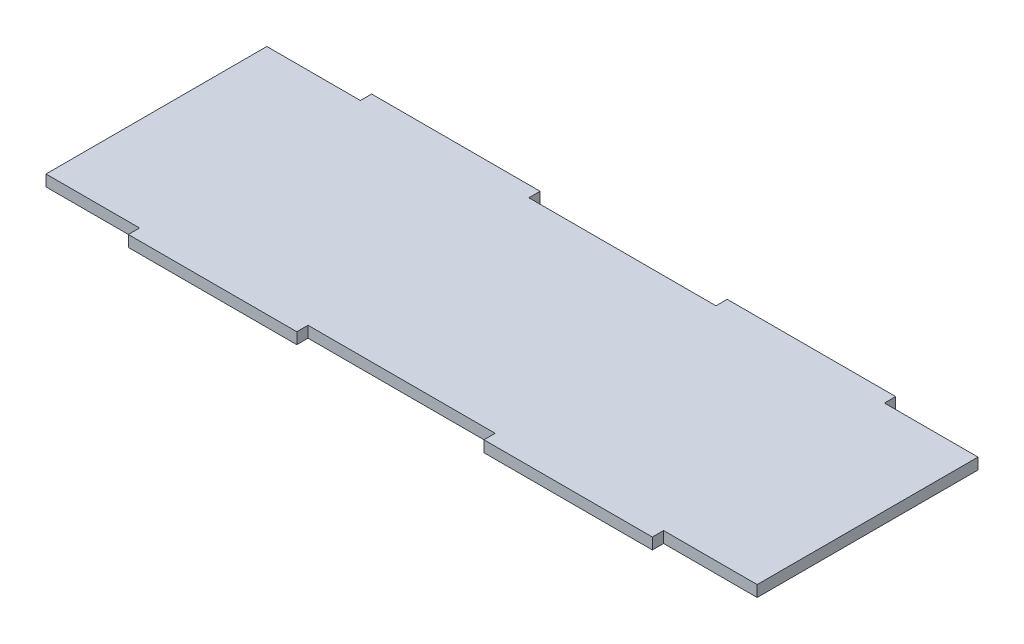
ISO-10303-21;
HEADER;
FILE_DESCRIPTION(('STEP AP214'),'2;1');
FILE_NAME('part.step','',(''),(''),'','','');
FILE_SCHEMA(('AUTOMOTIVE_DESIGN { 1 0 10303 214 1 1 1 1 }'));
ENDSEC;
DATA;
#1=APPLICATION_CONTEXT('core data for automotive mechanical design processes');
#2=APPLICATION_PROTOCOL_DEFINITION('international standard','automotive_design',2000,#1);
#3=PRODUCT_CONTEXT('',#1,'mechanical');
#4=PRODUCT('Part','Part','',(#3));
#5=PRODUCT_RELATED_PRODUCT_CATEGORY('part','',(#4));
#6=PRODUCT_DEFINITION_FORMATION('','',#4);
#7=PRODUCT_DEFINITION_CONTEXT('part definition',#1,'design');
#8=PRODUCT_DEFINITION('design','',#6,#7);
#9=PRODUCT_DEFINITION_SHAPE('','',#8);
#10=(LENGTH_UNIT() NAMED_UNIT(*) SI_UNIT(.MILLI.,.METRE.));
#11=(NAMED_UNIT(*) PLANE_ANGLE_UNIT() SI_UNIT($,.RADIAN.));
#12=(NAMED_UNIT(*) SI_UNIT($,.STERADIAN.) SOLID_ANGLE_UNIT());
#13=UNCERTAINTY_MEASURE_WITH_UNIT(LENGTH_MEASURE(1.E-05),#10,'distance_accuracy_value','');
#14=(GEOMETRIC_REPRESENTATION_CONTEXT(3) GLOBAL_UNCERTAINTY_ASSIGNED_CONTEXT((#13)) GLOBAL_UNIT_ASSIGNED_CONTEXT((#10,
#11,#12)) REPRESENTATION_CONTEXT('',''));
#15=CARTESIAN_POINT('',(0.,0.,0.));
#16=DIRECTION('',(0.,0.,1.));
#17=DIRECTION('',(1.,0.,0.));
#18=AXIS2_PLACEMENT_3D('',#15,#16,#17);
#19=CARTESIAN_POINT('',(-95.,3.,-32.5));
#20=DIRECTION('',(0.,0.,1.));
#21=DIRECTION('',(1.,0.,0.));
#22=AXIS2_PLACEMENT_3D('',#19,#20,#21);
#23=PLANE('',#22);
#24=DIRECTION('',(-1.,0.,0.));
#25=VECTOR('',#24,1.);
#26=CARTESIAN_POINT('',(-95.,3.,-32.5));
#27=LINE('',#26,#25);
#28=CARTESIAN_POINT('',(70.,3.,-32.5));
#29=VERTEX_POINT('',#28);
#30=CARTESIAN_POINT('',(25.,3.,-32.5));
#31=VERTEX_POINT('',#30);
#32=EDGE_CURVE('E210',#29,#31,#27,.T.);
#33=ORIENTED_EDGE('',*,*,#32,.F.);
#34=DIRECTION('',(0.,-1.,0.));
#35=VECTOR('',#34,1.);
#36=CARTESIAN_POINT('',(70.,3.000012,-32.5));
#37=LINE('',#36,#35);
#38=CARTESIAN_POINT('',(70.,0.,-32.5));
#39=VERTEX_POINT('',#38);
#40=EDGE_CURVE('E282',#29,#39,#37,.T.);
#41=ORIENTED_EDGE('',*,*,#40,.T.);
#42=DIRECTION('',(-1.,0.,0.));
#43=VECTOR('',#42,1.);
#44=CARTESIAN_POINT('',(-95.,0.,-32.5));
#45=LINE('',#44,#43);
#46=CARTESIAN_POINT('',(25.,0.,-32.5));
#47=VERTEX_POINT('',#46);
#48=EDGE_CURVE('E196',#39,#47,#45,.T.);
#49=ORIENTED_EDGE('',*,*,#48,.T.);
#50=DIRECTION('',(0.,-1.,0.));
#51=VECTOR('',#50,1.);
#52=CARTESIAN_POINT('',(25.,3.000012,-32.5));
#53=LINE('',#52,#51);
#54=EDGE_CURVE('E285',#31,#47,#53,.T.);
#55=ORIENTED_EDGE('',*,*,#54,.F.);
#56=EDGE_LOOP('',(#33,#41,#49,#55));
#57=FACE_BOUND('',#56,.T.);
#58=ADVANCED_FACE('F34',(#57),#23,.F.);
#59=CARTESIAN_POINT('',(-95.,3.,32.5));
#60=DIRECTION('',(0.,0.,-1.));
#61=DIRECTION('',(-1.,0.,0.));
#62=AXIS2_PLACEMENT_3D('',#59,#60,#61);
#63=PLANE('',#62);
#64=DIRECTION('',(1.,0.,0.));
#65=VECTOR('',#64,1.);
#66=CARTESIAN_POINT('',(-95.,3.,32.5));
#67=LINE('',#66,#65);
#68=CARTESIAN_POINT('',(-70.,3.,32.5));
#69=VERTEX_POINT('',#68);
#70=CARTESIAN_POINT('',(-25.,3.,32.5));
#71=VERTEX_POINT('',#70);
#72=EDGE_CURVE('E12',#69,#71,#67,.T.);
#73=ORIENTED_EDGE('',*,*,#72,.F.);
#74=DIRECTION('',(0.,-1.,0.));
#75=VECTOR('',#74,1.);
#76=CARTESIAN_POINT('',(-70.,3.000012,32.5));
#77=LINE('',#76,#75);
#78=CARTESIAN_POINT('',(-70.,0.,32.5));
#79=VERTEX_POINT('',#78);
#80=EDGE_CURVE('E257',#69,#79,#77,.T.);
#81=ORIENTED_EDGE('',*,*,#80,.T.);
#82=DIRECTION('',(1.,0.,0.));
#83=VECTOR('',#82,1.);
#84=CARTESIAN_POINT('',(-95.,0.,32.5));
#85=LINE('',#84,#83);
#86=CARTESIAN_POINT('',(-25.,0.,32.5));
#87=VERTEX_POINT('',#86);
#88=EDGE_CURVE('E198',#79,#87,#85,.T.);
#89=ORIENTED_EDGE('',*,*,#88,.T.);
#90=DIRECTION('',(0.,-1.,0.));
#91=VECTOR('',#90,1.);
#92=CARTESIAN_POINT('',(-25.,3.000012,32.5));
#93=LINE('',#92,#91);
#94=EDGE_CURVE('E260',#71,#87,#93,.T.);
#95=ORIENTED_EDGE('',*,*,#94,.F.);
#96=EDGE_LOOP('',(#73,#81,#89,#95));
#97=FACE_BOUND('',#96,.T.);
#98=ADVANCED_FACE('F331',(#97),#63,.F.);
#99=CARTESIAN_POINT('',(95.,3.,32.5));
#100=DIRECTION('',(-1.,0.,0.));
#101=DIRECTION('',(0.,0.,1.));
#102=AXIS2_PLACEMENT_3D('',#99,#100,#101);
#103=PLANE('',#102);
#104=DIRECTION('',(0.,0.,-1.));
#105=VECTOR('',#104,1.);
#106=CARTESIAN_POINT('',(95.,3.,32.5));
#107=LINE('',#106,#105);
#108=CARTESIAN_POINT('',(95.,3.,29.5));
#109=VERTEX_POINT('',#108);
#110=CARTESIAN_POINT('',(95.,3.,-29.5));
#111=VERTEX_POINT('',#110);
#112=EDGE_CURVE('E214',#109,#111,#107,.T.);
#113=ORIENTED_EDGE('',*,*,#112,.F.);
#114=DIRECTION('',(0.,-1.,0.));
#115=VECTOR('',#114,1.);
#116=CARTESIAN_POINT('',(95.,3.000012,29.5));
#117=LINE('',#116,#115);
#118=CARTESIAN_POINT('',(95.,0.,29.5));
#119=VERTEX_POINT('',#118);
#120=EDGE_CURVE('E274',#109,#119,#117,.T.);
#121=ORIENTED_EDGE('',*,*,#120,.T.);
#122=DIRECTION('',(0.,0.,-1.));
#123=VECTOR('',#122,1.);
#124=CARTESIAN_POINT('',(95.,0.,32.5));
#125=LINE('',#124,#123);
#126=CARTESIAN_POINT('',(95.,0.,-29.5));
#127=VERTEX_POINT('',#126);
#128=EDGE_CURVE('E204',#119,#127,#125,.T.);
#129=ORIENTED_EDGE('',*,*,#128,.T.);
#130=DIRECTION('',(0.,-1.,0.));
#131=VECTOR('',#130,1.);
#132=CARTESIAN_POINT('',(95.,3.000012,-29.5));
#133=LINE('',#132,#131);
#134=EDGE_CURVE('E277',#111,#127,#133,.T.);
#135=ORIENTED_EDGE('',*,*,#134,.F.);
#136=EDGE_LOOP('',(#113,#121,#129,#135));
#137=FACE_BOUND('',#136,.T.);
#138=ADVANCED_FACE('F36',(#137),#103,.F.);
#139=CARTESIAN_POINT('',(-25.,3.,-32.5));
#140=VERTEX_POINT('',#139);
#141=CARTESIAN_POINT('',(-70.,3.,-32.5));
#142=VERTEX_POINT('',#141);
#143=EDGE_CURVE('E211',#140,#142,#27,.T.);
#144=ORIENTED_EDGE('',*,*,#143,.F.);
#145=DIRECTION('',(0.,-1.,0.));
#146=VECTOR('',#145,1.);
#147=CARTESIAN_POINT('',(-25.,3.000012,-32.5));
#148=LINE('',#147,#146);
#149=CARTESIAN_POINT('',(-25.,0.,-32.5));
#150=VERTEX_POINT('',#149);
#151=EDGE_CURVE('E292',#140,#150,#148,.T.);
#152=ORIENTED_EDGE('',*,*,#151,.T.);
#153=CARTESIAN_POINT('',(-70.,0.,-32.5));
#154=VERTEX_POINT('',#153);
#155=EDGE_CURVE('E200',#150,#154,#45,.T.);
#156=ORIENTED_EDGE('',*,*,#155,.T.);
#157=DIRECTION('',(0.,-1.,0.));
#158=VECTOR('',#157,1.);
#159=CARTESIAN_POINT('',(-70.,3.000012,-32.5));
#160=LINE('',#159,#158);
#161=EDGE_CURVE('E295',#142,#154,#160,.T.);
#162=ORIENTED_EDGE('',*,*,#161,.F.);
#163=EDGE_LOOP('',(#144,#152,#156,#162));
#164=FACE_BOUND('',#163,.T.);
#165=ADVANCED_FACE('F351',(#164),#23,.F.);
#166=CARTESIAN_POINT('',(-95.,3.,32.5));
#167=DIRECTION('',(1.,0.,0.));
#168=DIRECTION('',(0.,0.,-1.));
#169=AXIS2_PLACEMENT_3D('',#166,#167,#168);
#170=PLANE('',#169);
#171=DIRECTION('',(0.,0.,1.));
#172=VECTOR('',#171,1.);
#173=CARTESIAN_POINT('',(-95.,0.,32.5));
#174=LINE('',#173,#172);
#175=CARTESIAN_POINT('',(-95.,0.,-29.5));
#176=VERTEX_POINT('',#175);
#177=CARTESIAN_POINT('',(-95.,0.,29.5));
#178=VERTEX_POINT('',#177);
#179=EDGE_CURVE('E189',#176,#178,#174,.T.);
#180=ORIENTED_EDGE('',*,*,#179,.T.);
#181=DIRECTION('',(0.,-1.,0.));
#182=VECTOR('',#181,1.);
#183=CARTESIAN_POINT('',(-95.,3.000012,29.5));
#184=LINE('',#183,#182);
#185=CARTESIAN_POINT('',(-95.,3.,29.5));
#186=VERTEX_POINT('',#185);
#187=EDGE_CURVE('E173',#186,#178,#184,.T.);
#188=ORIENTED_EDGE('',*,*,#187,.F.);
#189=DIRECTION('',(0.,0.,1.));
#190=VECTOR('',#189,1.);
#191=CARTESIAN_POINT('',(-95.,3.,32.5));
#192=LINE('',#191,#190);
#193=CARTESIAN_POINT('',(-95.,3.,-29.5));
#194=VERTEX_POINT('',#193);
#195=EDGE_CURVE('E208',#194,#186,#192,.T.);
#196=ORIENTED_EDGE('',*,*,#195,.F.);
#197=DIRECTION('',(0.,-1.,0.));
#198=VECTOR('',#197,1.);
#199=CARTESIAN_POINT('',(-95.,3.000012,-29.5));
#200=LINE('',#199,#198);
#201=EDGE_CURVE('E195',#194,#176,#200,.T.);
#202=ORIENTED_EDGE('',*,*,#201,.T.);
#203=EDGE_LOOP('',(#180,#188,#196,#202));
#204=FACE_BOUND('',#203,.T.);
#205=ADVANCED_FACE('F194',(#204),#170,.F.);
#206=CARTESIAN_POINT('',(25.,3.,32.5));
#207=VERTEX_POINT('',#206);
#208=CARTESIAN_POINT('',(70.,3.,32.5));
#209=VERTEX_POINT('',#208);
#210=EDGE_CURVE('E43',#207,#209,#67,.T.);
#211=ORIENTED_EDGE('',*,*,#210,.F.);
#212=DIRECTION('',(0.,-1.,0.));
#213=VECTOR('',#212,1.);
#214=CARTESIAN_POINT('',(25.,3.000012,32.5));
#215=LINE('',#214,#213);
#216=CARTESIAN_POINT('',(25.,0.,32.5));
#217=VERTEX_POINT('',#216);
#218=EDGE_CURVE('E266',#207,#217,#215,.T.);
#219=ORIENTED_EDGE('',*,*,#218,.T.);
#220=CARTESIAN_POINT('',(70.,0.,32.5));
#221=VERTEX_POINT('',#220);
#222=EDGE_CURVE('E38',#217,#221,#85,.T.);
#223=ORIENTED_EDGE('',*,*,#222,.T.);
#224=DIRECTION('',(0.,-1.,0.));
#225=VECTOR('',#224,1.);
#226=CARTESIAN_POINT('',(70.,3.000012,32.5));
#227=LINE('',#226,#225);
#228=EDGE_CURVE('E269',#209,#221,#227,.T.);
#229=ORIENTED_EDGE('',*,*,#228,.F.);
#230=EDGE_LOOP('',(#211,#219,#223,#229));
#231=FACE_BOUND('',#230,.T.);
#232=ADVANCED_FACE('F389',(#231),#63,.F.);
#233=CARTESIAN_POINT('',(0.,3.,0.));
#234=DIRECTION('',(0.,-1.,0.));
#235=DIRECTION('',(0.,0.,-1.));
#236=AXIS2_PLACEMENT_3D('',#233,#234,#235);
#237=PLANE('',#236);
#238=ORIENTED_EDGE('',*,*,#195,.T.);
#239=DIRECTION('',(1.,0.,0.));
#240=VECTOR('',#239,1.);
#241=CARTESIAN_POINT('',(0.,3.,29.5));
#242=LINE('',#241,#240);
#243=CARTESIAN_POINT('',(-70.,3.,29.5));
#244=VERTEX_POINT('',#243);
#245=EDGE_CURVE('E176',#186,#244,#242,.T.);
#246=ORIENTED_EDGE('',*,*,#245,.T.);
#247=DIRECTION('',(0.,0.,1.));
#248=VECTOR('',#247,1.);
#249=CARTESIAN_POINT('',(-70.,3.,0.));
#250=LINE('',#249,#248);
#251=EDGE_CURVE('E218',#244,#69,#250,.T.);
#252=ORIENTED_EDGE('',*,*,#251,.T.);
#253=ORIENTED_EDGE('',*,*,#72,.T.);
#254=DIRECTION('',(0.,0.,-1.));
#255=VECTOR('',#254,1.);
#256=CARTESIAN_POINT('',(-25.,3.,0.));
#257=LINE('',#256,#255);
#258=CARTESIAN_POINT('',(-25.,3.,29.5));
#259=VERTEX_POINT('',#258);
#260=EDGE_CURVE('E221',#71,#259,#257,.T.);
#261=ORIENTED_EDGE('',*,*,#260,.T.);
#262=DIRECTION('',(1.,0.,0.));
#263=VECTOR('',#262,1.);
#264=CARTESIAN_POINT('',(0.,3.,29.5));
#265=LINE('',#264,#263);
#266=CARTESIAN_POINT('',(25.,3.,29.5));
#267=VERTEX_POINT('',#266);
#268=EDGE_CURVE('E224',#259,#267,#265,.T.);
#269=ORIENTED_EDGE('',*,*,#268,.T.);
#270=DIRECTION('',(0.,0.,1.));
#271=VECTOR('',#270,1.);
#272=CARTESIAN_POINT('',(25.,3.,0.));
#273=LINE('',#272,#271);
#274=EDGE_CURVE('E227',#267,#207,#273,.T.);
#275=ORIENTED_EDGE('',*,*,#274,.T.);
#276=ORIENTED_EDGE('',*,*,#210,.T.);
#277=DIRECTION('',(0.,0.,-1.));
#278=VECTOR('',#277,1.);
#279=CARTESIAN_POINT('',(70.,3.,0.));
#280=LINE('',#279,#278);
#281=CARTESIAN_POINT('',(70.,3.,29.5));
#282=VERTEX_POINT('',#281);
#283=EDGE_CURVE('E230',#209,#282,#280,.T.);
#284=ORIENTED_EDGE('',*,*,#283,.T.);
#285=DIRECTION('',(1.,0.,0.));
#286=VECTOR('',#285,1.);
#287=CARTESIAN_POINT('',(0.,3.,29.5));
#288=LINE('',#287,#286);
#289=EDGE_CURVE('E233',#282,#109,#288,.T.);
#290=ORIENTED_EDGE('',*,*,#289,.T.);
#291=ORIENTED_EDGE('',*,*,#112,.T.);
#292=DIRECTION('',(-1.,0.,0.));
#293=VECTOR('',#292,1.);
#294=CARTESIAN_POINT('',(0.,3.,-29.5));
#295=LINE('',#294,#293);
#296=CARTESIAN_POINT('',(70.,3.,-29.5));
#297=VERTEX_POINT('',#296);
#298=EDGE_CURVE('E236',#111,#297,#295,.T.);
#299=ORIENTED_EDGE('',*,*,#298,.T.);
#300=DIRECTION('',(0.,0.,-1.));
#301=VECTOR('',#300,1.);
#302=CARTESIAN_POINT('',(70.,3.,0.));
#303=LINE('',#302,#301);
#304=EDGE_CURVE('E239',#297,#29,#303,.T.);
#305=ORIENTED_EDGE('',*,*,#304,.T.);
#306=ORIENTED_EDGE('',*,*,#32,.T.);
#307=DIRECTION('',(0.,0.,1.));
#308=VECTOR('',#307,1.);
#309=CARTESIAN_POINT('',(25.,3.,0.));
#310=LINE('',#309,#308);
#311=CARTESIAN_POINT('',(25.,3.,-29.5));
#312=VERTEX_POINT('',#311);
#313=EDGE_CURVE('E242',#31,#312,#310,.T.);
#314=ORIENTED_EDGE('',*,*,#313,.T.);
#315=DIRECTION('',(-1.,0.,0.));
#316=VECTOR('',#315,1.);
#317=CARTESIAN_POINT('',(0.,3.,-29.5));
#318=LINE('',#317,#316);
#319=CARTESIAN_POINT('',(-25.,3.,-29.5));
#320=VERTEX_POINT('',#319);
#321=EDGE_CURVE('E245',#312,#320,#318,.T.);
#322=ORIENTED_EDGE('',*,*,#321,.T.);
#323=DIRECTION('',(0.,0.,-1.));
#324=VECTOR('',#323,1.);
#325=CARTESIAN_POINT('',(-25.,3.,0.));
#326=LINE('',#325,#324);
#327=EDGE_CURVE('E248',#320,#140,#326,.T.);
#328=ORIENTED_EDGE('',*,*,#327,.T.);
#329=ORIENTED_EDGE('',*,*,#143,.T.);
#330=DIRECTION('',(0.,0.,1.));
#331=VECTOR('',#330,1.);
#332=CARTESIAN_POINT('',(-70.,3.,0.));
#333=LINE('',#332,#331);
#334=CARTESIAN_POINT('',(-70.,3.,-29.5));
#335=VERTEX_POINT('',#334);
#336=EDGE_CURVE('E251',#142,#335,#333,.T.);
#337=ORIENTED_EDGE('',*,*,#336,.T.);
#338=DIRECTION('',(-1.,0.,0.));
#339=VECTOR('',#338,1.);
#340=CARTESIAN_POINT('',(0.,3.,-29.5));
#341=LINE('',#340,#339);
#342=EDGE_CURVE('E181',#335,#194,#341,.T.);
#343=ORIENTED_EDGE('',*,*,#342,.T.);
#344=EDGE_LOOP('',(#238,#246,#252,#253,#261,#269,#275,#276,#284,#290,#291,#299,#305,#306,#314,
#322,#328,#329,#337,#343));
#345=FACE_BOUND('',#344,.T.);
#346=ADVANCED_FACE('F339',(#345),#237,.F.);
#347=CARTESIAN_POINT('',(0.,0.,0.));
#348=DIRECTION('',(0.,-1.,0.));
#349=DIRECTION('',(0.,0.,-1.));
#350=AXIS2_PLACEMENT_3D('',#347,#348,#349);
#351=PLANE('',#350);
#352=DIRECTION('',(1.,0.,0.));
#353=VECTOR('',#352,1.);
#354=CARTESIAN_POINT('',(-95.,0.,29.5));
#355=LINE('',#354,#353);
#356=CARTESIAN_POINT('',(-70.,0.,29.5));
#357=VERTEX_POINT('',#356);
#358=EDGE_CURVE('E51',#178,#357,#355,.T.);
#359=ORIENTED_EDGE('',*,*,#358,.F.);
#360=ORIENTED_EDGE('',*,*,#179,.F.);
#361=DIRECTION('',(-1.,0.,0.));
#362=VECTOR('',#361,1.);
#363=CARTESIAN_POINT('',(-95.,0.,-29.5));
#364=LINE('',#363,#362);
#365=CARTESIAN_POINT('',(-70.,0.,-29.5));
#366=VERTEX_POINT('',#365);
#367=EDGE_CURVE('E301',#366,#176,#364,.T.);
#368=ORIENTED_EDGE('',*,*,#367,.F.);
#369=DIRECTION('',(0.,0.,1.));
#370=VECTOR('',#369,1.);
#371=CARTESIAN_POINT('',(-70.,0.,-29.5));
#372=LINE('',#371,#370);
#373=EDGE_CURVE('E303',#154,#366,#372,.T.);
#374=ORIENTED_EDGE('',*,*,#373,.F.);
#375=ORIENTED_EDGE('',*,*,#155,.F.);
#376=DIRECTION('',(0.,0.,-1.));
#377=VECTOR('',#376,1.);
#378=CARTESIAN_POINT('',(-25.,0.,-32.5));
#379=LINE('',#378,#377);
#380=CARTESIAN_POINT('',(-25.,0.,-29.5));
#381=VERTEX_POINT('',#380);
#382=EDGE_CURVE('E305',#381,#150,#379,.T.);
#383=ORIENTED_EDGE('',*,*,#382,.F.);
#384=DIRECTION('',(-1.,0.,0.));
#385=VECTOR('',#384,1.);
#386=CARTESIAN_POINT('',(-25.,0.,-29.5));
#387=LINE('',#386,#385);
#388=CARTESIAN_POINT('',(25.,0.,-29.5));
#389=VERTEX_POINT('',#388);
#390=EDGE_CURVE('E307',#389,#381,#387,.T.);
#391=ORIENTED_EDGE('',*,*,#390,.F.);
#392=DIRECTION('',(0.,0.,1.));
#393=VECTOR('',#392,1.);
#394=CARTESIAN_POINT('',(25.,0.,-32.5));
#395=LINE('',#394,#393);
#396=EDGE_CURVE('E309',#47,#389,#395,.T.);
#397=ORIENTED_EDGE('',*,*,#396,.F.);
#398=ORIENTED_EDGE('',*,*,#48,.F.);
#399=DIRECTION('',(0.,0.,-1.));
#400=VECTOR('',#399,1.);
#401=CARTESIAN_POINT('',(70.,0.,-29.5));
#402=LINE('',#401,#400);
#403=CARTESIAN_POINT('',(70.,0.,-29.5));
#404=VERTEX_POINT('',#403);
#405=EDGE_CURVE('E312',#404,#39,#402,.T.);
#406=ORIENTED_EDGE('',*,*,#405,.F.);
#407=DIRECTION('',(-1.,0.,0.));
#408=VECTOR('',#407,1.);
#409=CARTESIAN_POINT('',(95.,0.,-29.5));
#410=LINE('',#409,#408);
#411=EDGE_CURVE('E314',#127,#404,#410,.T.);
#412=ORIENTED_EDGE('',*,*,#411,.F.);
#413=ORIENTED_EDGE('',*,*,#128,.F.);
#414=DIRECTION('',(1.,0.,0.));
#415=VECTOR('',#414,1.);
#416=CARTESIAN_POINT('',(95.,0.,29.5));
#417=LINE('',#416,#415);
#418=CARTESIAN_POINT('',(70.,0.,29.5));
#419=VERTEX_POINT('',#418);
#420=EDGE_CURVE('E316',#419,#119,#417,.T.);
#421=ORIENTED_EDGE('',*,*,#420,.F.);
#422=DIRECTION('',(0.,0.,-1.));
#423=VECTOR('',#422,1.);
#424=CARTESIAN_POINT('',(70.,0.,29.5));
#425=LINE('',#424,#423);
#426=EDGE_CURVE('E318',#221,#419,#425,.T.);
#427=ORIENTED_EDGE('',*,*,#426,.F.);
#428=ORIENTED_EDGE('',*,*,#222,.F.);
#429=DIRECTION('',(0.,0.,1.));
#430=VECTOR('',#429,1.);
#431=CARTESIAN_POINT('',(25.,0.,32.5));
#432=LINE('',#431,#430);
#433=CARTESIAN_POINT('',(25.,0.,29.5));
#434=VERTEX_POINT('',#433);
#435=EDGE_CURVE('E320',#434,#217,#432,.T.);
#436=ORIENTED_EDGE('',*,*,#435,.F.);
#437=DIRECTION('',(1.,0.,0.));
#438=VECTOR('',#437,1.);
#439=CARTESIAN_POINT('',(-25.,0.,29.5));
#440=LINE('',#439,#438);
#441=CARTESIAN_POINT('',(-25.,0.,29.5));
#442=VERTEX_POINT('',#441);
#443=EDGE_CURVE('E59',#442,#434,#440,.T.);
#444=ORIENTED_EDGE('',*,*,#443,.F.);
#445=DIRECTION('',(0.,0.,-1.));
#446=VECTOR('',#445,1.);
#447=CARTESIAN_POINT('',(-25.,0.,32.5));
#448=LINE('',#447,#446);
#449=EDGE_CURVE('E323',#87,#442,#448,.T.);
#450=ORIENTED_EDGE('',*,*,#449,.F.);
#451=ORIENTED_EDGE('',*,*,#88,.F.);
#452=DIRECTION('',(0.,0.,1.));
#453=VECTOR('',#452,1.);
#454=CARTESIAN_POINT('',(-70.,0.,29.5));
#455=LINE('',#454,#453);
#456=EDGE_CURVE('E191',#357,#79,#455,.T.);
#457=ORIENTED_EDGE('',*,*,#456,.F.);
#458=EDGE_LOOP('',(#359,#360,#368,#374,#375,#383,#391,#397,#398,#406,#412,#413,#421,#427,#428,
#436,#444,#450,#451,#457));
#459=FACE_BOUND('',#458,.T.);
#460=ADVANCED_FACE('F187',(#459),#351,.T.);
#461=CARTESIAN_POINT('',(-95.,3.000012,-29.5));
#462=DIRECTION('',(0.,0.,1.));
#463=DIRECTION('',(1.,0.,0.));
#464=AXIS2_PLACEMENT_3D('',#461,#462,#463);
#465=PLANE('',#464);
#466=DIRECTION('',(0.,-1.,0.));
#467=VECTOR('',#466,1.);
#468=CARTESIAN_POINT('',(-70.,3.000012,-29.5));
#469=LINE('',#468,#467);
#470=EDGE_CURVE('E297',#335,#366,#469,.T.);
#471=ORIENTED_EDGE('',*,*,#470,.T.);
#472=ORIENTED_EDGE('',*,*,#367,.T.);
#473=ORIENTED_EDGE('',*,*,#201,.F.);
#474=ORIENTED_EDGE('',*,*,#342,.F.);
#475=EDGE_LOOP('',(#471,#472,#473,#474));
#476=FACE_BOUND('',#475,.T.);
#477=ADVANCED_FACE('F342',(#476),#465,.F.);
#478=CARTESIAN_POINT('',(-70.,3.000012,-29.5));
#479=DIRECTION('',(1.,0.,0.));
#480=DIRECTION('',(0.,0.,-1.));
#481=AXIS2_PLACEMENT_3D('',#478,#479,#480);
#482=PLANE('',#481);
#483=ORIENTED_EDGE('',*,*,#161,.T.);
#484=ORIENTED_EDGE('',*,*,#373,.T.);
#485=ORIENTED_EDGE('',*,*,#470,.F.);
#486=ORIENTED_EDGE('',*,*,#336,.F.);
#487=EDGE_LOOP('',(#483,#484,#485,#486));
#488=FACE_BOUND('',#487,.T.);
#489=ADVANCED_FACE('F344',(#488),#482,.F.);
#490=CARTESIAN_POINT('',(-25.,3.000012,-32.5));
#491=DIRECTION('',(-1.,0.,0.));
#492=DIRECTION('',(0.,0.,1.));
#493=AXIS2_PLACEMENT_3D('',#490,#491,#492);
#494=PLANE('',#493);
#495=DIRECTION('',(0.,-1.,0.));
#496=VECTOR('',#495,1.);
#497=CARTESIAN_POINT('',(-25.,3.000012,-29.5));
#498=LINE('',#497,#496);
#499=EDGE_CURVE('E289',#320,#381,#498,.T.);
#500=ORIENTED_EDGE('',*,*,#499,.T.);
#501=ORIENTED_EDGE('',*,*,#382,.T.);
#502=ORIENTED_EDGE('',*,*,#151,.F.);
#503=ORIENTED_EDGE('',*,*,#327,.F.);
#504=EDGE_LOOP('',(#500,#501,#502,#503));
#505=FACE_BOUND('',#504,.T.);
#506=ADVANCED_FACE('F353',(#505),#494,.F.);
#507=CARTESIAN_POINT('',(-25.,3.000012,-29.5));
#508=DIRECTION('',(0.,0.,1.));
#509=DIRECTION('',(1.,0.,0.));
#510=AXIS2_PLACEMENT_3D('',#507,#508,#509);
#511=PLANE('',#510);
#512=DIRECTION('',(0.,-1.,0.));
#513=VECTOR('',#512,1.);
#514=CARTESIAN_POINT('',(25.,3.000012,-29.5));
#515=LINE('',#514,#513);
#516=EDGE_CURVE('E287',#312,#389,#515,.T.);
#517=ORIENTED_EDGE('',*,*,#516,.T.);
#518=ORIENTED_EDGE('',*,*,#390,.T.);
#519=ORIENTED_EDGE('',*,*,#499,.F.);
#520=ORIENTED_EDGE('',*,*,#321,.F.);
#521=EDGE_LOOP('',(#517,#518,#519,#520));
#522=FACE_BOUND('',#521,.T.);
#523=ADVANCED_FACE('F358',(#522),#511,.F.);
#524=CARTESIAN_POINT('',(25.,3.000012,-32.5));
#525=DIRECTION('',(1.,0.,0.));
#526=DIRECTION('',(0.,0.,-1.));
#527=AXIS2_PLACEMENT_3D('',#524,#525,#526);
#528=PLANE('',#527);
#529=ORIENTED_EDGE('',*,*,#54,.T.);
#530=ORIENTED_EDGE('',*,*,#396,.T.);
#531=ORIENTED_EDGE('',*,*,#516,.F.);
#532=ORIENTED_EDGE('',*,*,#313,.F.);
#533=EDGE_LOOP('',(#529,#530,#531,#532));
#534=FACE_BOUND('',#533,.T.);
#535=ADVANCED_FACE('F360',(#534),#528,.F.);
#536=CARTESIAN_POINT('',(70.,3.000012,-29.5));
#537=DIRECTION('',(-1.,0.,0.));
#538=DIRECTION('',(0.,0.,1.));
#539=AXIS2_PLACEMENT_3D('',#536,#537,#538);
#540=PLANE('',#539);
#541=DIRECTION('',(0.,-1.,0.));
#542=VECTOR('',#541,1.);
#543=CARTESIAN_POINT('',(70.,3.000012,-29.5));
#544=LINE('',#543,#542);
#545=EDGE_CURVE('E279',#297,#404,#544,.T.);
#546=ORIENTED_EDGE('',*,*,#545,.T.);
#547=ORIENTED_EDGE('',*,*,#405,.T.);
#548=ORIENTED_EDGE('',*,*,#40,.F.);
#549=ORIENTED_EDGE('',*,*,#304,.F.);
#550=EDGE_LOOP('',(#546,#547,#548,#549));
#551=FACE_BOUND('',#550,.T.);
#552=ADVANCED_FACE('F369',(#551),#540,.F.);
#553=CARTESIAN_POINT('',(95.,3.000012,-29.5));
#554=DIRECTION('',(0.,0.,1.));
#555=DIRECTION('',(1.,0.,0.));
#556=AXIS2_PLACEMENT_3D('',#553,#554,#555);
#557=PLANE('',#556);
#558=ORIENTED_EDGE('',*,*,#134,.T.);
#559=ORIENTED_EDGE('',*,*,#411,.T.);
#560=ORIENTED_EDGE('',*,*,#545,.F.);
#561=ORIENTED_EDGE('',*,*,#298,.F.);
#562=EDGE_LOOP('',(#558,#559,#560,#561));
#563=FACE_BOUND('',#562,.T.);
#564=ADVANCED_FACE('F374',(#563),#557,.F.);
#565=CARTESIAN_POINT('',(95.,3.000012,29.5));
#566=DIRECTION('',(0.,0.,-1.));
#567=DIRECTION('',(-1.,0.,0.));
#568=AXIS2_PLACEMENT_3D('',#565,#566,#567);
#569=PLANE('',#568);
#570=DIRECTION('',(0.,-1.,0.));
#571=VECTOR('',#570,1.);
#572=CARTESIAN_POINT('',(70.,3.000012,29.5));
#573=LINE('',#572,#571);
#574=EDGE_CURVE('E271',#282,#419,#573,.T.);
#575=ORIENTED_EDGE('',*,*,#574,.T.);
#576=ORIENTED_EDGE('',*,*,#420,.T.);
#577=ORIENTED_EDGE('',*,*,#120,.F.);
#578=ORIENTED_EDGE('',*,*,#289,.F.);
#579=EDGE_LOOP('',(#575,#576,#577,#578));
#580=FACE_BOUND('',#579,.T.);
#581=ADVANCED_FACE('F382',(#580),#569,.F.);
#582=CARTESIAN_POINT('',(70.,3.000012,29.5));
#583=DIRECTION('',(-1.,0.,0.));
#584=DIRECTION('',(0.,0.,1.));
#585=AXIS2_PLACEMENT_3D('',#582,#583,#584);
#586=PLANE('',#585);
#587=ORIENTED_EDGE('',*,*,#228,.T.);
#588=ORIENTED_EDGE('',*,*,#426,.T.);
#589=ORIENTED_EDGE('',*,*,#574,.F.);
#590=ORIENTED_EDGE('',*,*,#283,.F.);
#591=EDGE_LOOP('',(#587,#588,#589,#590));
#592=FACE_BOUND('',#591,.T.);
#593=ADVANCED_FACE('F385',(#592),#586,.F.);
#594=CARTESIAN_POINT('',(25.,3.000012,32.5));
#595=DIRECTION('',(1.,0.,0.));
#596=DIRECTION('',(0.,0.,-1.));
#597=AXIS2_PLACEMENT_3D('',#594,#595,#596);
#598=PLANE('',#597);
#599=DIRECTION('',(0.,-1.,0.));
#600=VECTOR('',#599,1.);
#601=CARTESIAN_POINT('',(25.,3.000012,29.5));
#602=LINE('',#601,#600);
#603=EDGE_CURVE('E264',#267,#434,#602,.T.);
#604=ORIENTED_EDGE('',*,*,#603,.T.);
#605=ORIENTED_EDGE('',*,*,#435,.T.);
#606=ORIENTED_EDGE('',*,*,#218,.F.);
#607=ORIENTED_EDGE('',*,*,#274,.F.);
#608=EDGE_LOOP('',(#604,#605,#606,#607));
#609=FACE_BOUND('',#608,.T.);
#610=ADVANCED_FACE('F391',(#609),#598,.F.);
#611=CARTESIAN_POINT('',(-25.,3.000012,29.5));
#612=DIRECTION('',(0.,0.,-1.));
#613=DIRECTION('',(-1.,0.,0.));
#614=AXIS2_PLACEMENT_3D('',#611,#612,#613);
#615=PLANE('',#614);
#616=DIRECTION('',(0.,-1.,0.));
#617=VECTOR('',#616,1.);
#618=CARTESIAN_POINT('',(-25.,3.000012,29.5));
#619=LINE('',#618,#617);
#620=EDGE_CURVE('E262',#259,#442,#619,.T.);
#621=ORIENTED_EDGE('',*,*,#620,.T.);
#622=ORIENTED_EDGE('',*,*,#443,.T.);
#623=ORIENTED_EDGE('',*,*,#603,.F.);
#624=ORIENTED_EDGE('',*,*,#268,.F.);
#625=EDGE_LOOP('',(#621,#622,#623,#624));
#626=FACE_BOUND('',#625,.T.);
#627=ADVANCED_FACE('F392',(#626),#615,.F.);
#628=CARTESIAN_POINT('',(-25.,3.000012,32.5));
#629=DIRECTION('',(-1.,0.,0.));
#630=DIRECTION('',(0.,0.,1.));
#631=AXIS2_PLACEMENT_3D('',#628,#629,#630);
#632=PLANE('',#631);
#633=ORIENTED_EDGE('',*,*,#94,.T.);
#634=ORIENTED_EDGE('',*,*,#449,.T.);
#635=ORIENTED_EDGE('',*,*,#620,.F.);
#636=ORIENTED_EDGE('',*,*,#260,.F.);
#637=EDGE_LOOP('',(#633,#634,#635,#636));
#638=FACE_BOUND('',#637,.T.);
#639=ADVANCED_FACE('F337',(#638),#632,.F.);
#640=CARTESIAN_POINT('',(-95.,3.000012,29.5));
#641=DIRECTION('',(0.,0.,-1.));
#642=DIRECTION('',(-1.,0.,0.));
#643=AXIS2_PLACEMENT_3D('',#640,#641,#642);
#644=PLANE('',#643);
#645=ORIENTED_EDGE('',*,*,#187,.T.);
#646=ORIENTED_EDGE('',*,*,#358,.T.);
#647=DIRECTION('',(0.,-1.,0.));
#648=VECTOR('',#647,1.);
#649=CARTESIAN_POINT('',(-70.,3.000012,29.5));
#650=LINE('',#649,#648);
#651=EDGE_CURVE('E182',#244,#357,#650,.T.);
#652=ORIENTED_EDGE('',*,*,#651,.F.);
#653=ORIENTED_EDGE('',*,*,#245,.F.);
#654=EDGE_LOOP('',(#645,#646,#652,#653));
#655=FACE_BOUND('',#654,.T.);
#656=ADVANCED_FACE('F174',(#655),#644,.F.);
#657=CARTESIAN_POINT('',(-70.,3.000012,29.5));
#658=DIRECTION('',(1.,0.,0.));
#659=DIRECTION('',(0.,0.,-1.));
#660=AXIS2_PLACEMENT_3D('',#657,#658,#659);
#661=PLANE('',#660);
#662=ORIENTED_EDGE('',*,*,#651,.T.);
#663=ORIENTED_EDGE('',*,*,#456,.T.);
#664=ORIENTED_EDGE('',*,*,#80,.F.);
#665=ORIENTED_EDGE('',*,*,#251,.F.);
#666=EDGE_LOOP('',(#662,#663,#664,#665));
#667=FACE_BOUND('',#666,.T.);
#668=ADVANCED_FACE('F327',(#667),#661,.F.);
#669=CLOSED_SHELL('',(#58,#98,#138,#165,#205,#232,#346,#460,#477,#489,#506,#523,#535,#552,#564,
#581,#593,#610,#627,#639,#656,#668));
#670=MANIFOLD_SOLID_BREP('B2',#669);
#671=ADVANCED_BREP_SHAPE_REPRESENTATION('',(#18,#670),#14);
#672=SHAPE_DEFINITION_REPRESENTATION(#9,#671);
ENDSEC;
END-ISO-10303-21;
